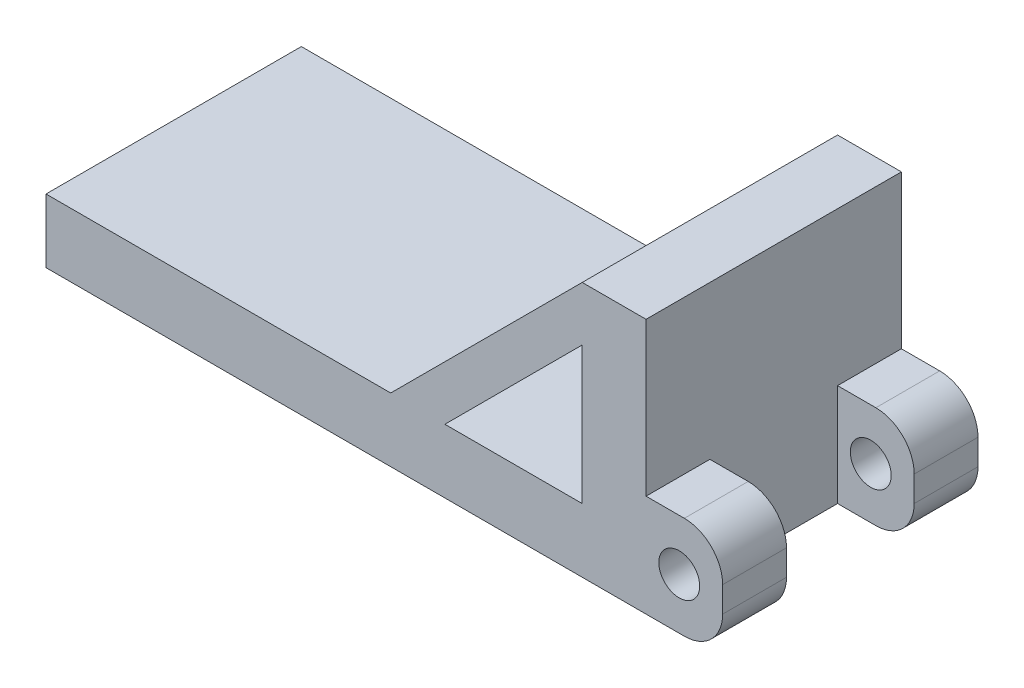
ISO-10303-21;
HEADER;
FILE_DESCRIPTION(('STEP AP214'),'2;1');
FILE_NAME('part.step','',(''),(''),'','','');
FILE_SCHEMA(('AUTOMOTIVE_DESIGN { 1 0 10303 214 1 1 1 1 }'));
ENDSEC;
DATA;
#1=APPLICATION_CONTEXT('core data for automotive mechanical design processes');
#2=APPLICATION_PROTOCOL_DEFINITION('international standard','automotive_design',2000,#1);
#3=PRODUCT_CONTEXT('',#1,'mechanical');
#4=PRODUCT('Part','Part','',(#3));
#5=PRODUCT_RELATED_PRODUCT_CATEGORY('part','',(#4));
#6=PRODUCT_DEFINITION_FORMATION('','',#4);
#7=PRODUCT_DEFINITION_CONTEXT('part definition',#1,'design');
#8=PRODUCT_DEFINITION('design','',#6,#7);
#9=PRODUCT_DEFINITION_SHAPE('','',#8);
#10=(LENGTH_UNIT() NAMED_UNIT(*) SI_UNIT(.MILLI.,.METRE.));
#11=(NAMED_UNIT(*) PLANE_ANGLE_UNIT() SI_UNIT($,.RADIAN.));
#12=(NAMED_UNIT(*) SI_UNIT($,.STERADIAN.) SOLID_ANGLE_UNIT());
#13=UNCERTAINTY_MEASURE_WITH_UNIT(LENGTH_MEASURE(1.E-05),#10,'distance_accuracy_value','');
#14=(GEOMETRIC_REPRESENTATION_CONTEXT(3) GLOBAL_UNCERTAINTY_ASSIGNED_CONTEXT((#13)) GLOBAL_UNIT_ASSIGNED_CONTEXT((#10,
#11,#12)) REPRESENTATION_CONTEXT('',''));
#15=CARTESIAN_POINT('',(0.,0.,0.));
#16=DIRECTION('',(0.,0.,1.));
#17=DIRECTION('',(1.,0.,0.));
#18=AXIS2_PLACEMENT_3D('',#15,#16,#17);
#19=CARTESIAN_POINT('',(8.,0.,20.));
#20=DIRECTION('',(-1.,0.,0.));
#21=DIRECTION('',(0.,0.,1.));
#22=AXIS2_PLACEMENT_3D('',#19,#20,#21);
#23=PLANE('',#22);
#24=DIRECTION('',(0.,0.,-1.));
#25=VECTOR('',#24,1.);
#26=CARTESIAN_POINT('',(8.,5.,20.));
#27=LINE('',#26,#25);
#28=CARTESIAN_POINT('',(8.,5.,0.));
#29=VERTEX_POINT('',#28);
#30=CARTESIAN_POINT('',(8.,5.,5.));
#31=VERTEX_POINT('',#30);
#32=EDGE_CURVE('E186',#29,#31,#27,.F.);
#33=ORIENTED_EDGE('',*,*,#32,.T.);
#34=DIRECTION('',(0.,1.,0.));
#35=VECTOR('',#34,1.);
#36=CARTESIAN_POINT('',(8.00000000000001,-0.000999999999999265,5.));
#37=LINE('',#36,#35);
#38=CARTESIAN_POINT('',(8.,3.,5.));
#39=VERTEX_POINT('',#38);
#40=EDGE_CURVE('E166',#39,#31,#37,.T.);
#41=ORIENTED_EDGE('',*,*,#40,.F.);
#42=DIRECTION('',(0.,0.,-1.));
#43=VECTOR('',#42,1.);
#44=CARTESIAN_POINT('',(8.,3.,20.));
#45=LINE('',#44,#43);
#46=CARTESIAN_POINT('',(8.,3.,0.));
#47=VERTEX_POINT('',#46);
#48=EDGE_CURVE('E193',#39,#47,#45,.T.);
#49=ORIENTED_EDGE('',*,*,#48,.T.);
#50=DIRECTION('',(0.,1.,0.));
#51=VECTOR('',#50,1.);
#52=CARTESIAN_POINT('',(8.,0.,0.));
#53=LINE('',#52,#51);
#54=EDGE_CURVE('E192',#47,#29,#53,.T.);
#55=ORIENTED_EDGE('',*,*,#54,.T.);
#56=EDGE_LOOP('',(#33,#41,#49,#55));
#57=FACE_BOUND('',#56,.T.);
#58=ADVANCED_FACE('F35',(#57),#23,.F.);
#59=CARTESIAN_POINT('',(8.,8.,20.));
#60=DIRECTION('',(0.,-1.,0.));
#61=DIRECTION('',(1.,0.,0.));
#62=AXIS2_PLACEMENT_3D('',#59,#60,#61);
#63=PLANE('',#62);
#64=DIRECTION('',(0.,0.,-1.));
#65=VECTOR('',#64,1.);
#66=CARTESIAN_POINT('',(2.,8.,20.));
#67=LINE('',#66,#65);
#68=CARTESIAN_POINT('',(2.,8.,5.));
#69=VERTEX_POINT('',#68);
#70=CARTESIAN_POINT('',(2.,8.,0.));
#71=VERTEX_POINT('',#70);
#72=EDGE_CURVE('E253',#69,#71,#67,.T.);
#73=ORIENTED_EDGE('',*,*,#72,.F.);
#74=DIRECTION('',(-1.,0.,0.));
#75=VECTOR('',#74,1.);
#76=CARTESIAN_POINT('',(2.,8.,5.));
#77=LINE('',#76,#75);
#78=CARTESIAN_POINT('',(5.,8.,5.));
#79=VERTEX_POINT('',#78);
#80=EDGE_CURVE('E222',#79,#69,#77,.T.);
#81=ORIENTED_EDGE('',*,*,#80,.F.);
#82=DIRECTION('',(0.,0.,-1.));
#83=VECTOR('',#82,1.);
#84=CARTESIAN_POINT('',(5.,8.,20.));
#85=LINE('',#84,#83);
#86=CARTESIAN_POINT('',(5.,8.,0.));
#87=VERTEX_POINT('',#86);
#88=EDGE_CURVE('E43',#79,#87,#85,.T.);
#89=ORIENTED_EDGE('',*,*,#88,.T.);
#90=DIRECTION('',(-1.,0.,0.));
#91=VECTOR('',#90,1.);
#92=CARTESIAN_POINT('',(8.,8.,0.));
#93=LINE('',#92,#91);
#94=EDGE_CURVE('E220',#87,#71,#93,.T.);
#95=ORIENTED_EDGE('',*,*,#94,.T.);
#96=EDGE_LOOP('',(#73,#81,#89,#95));
#97=FACE_BOUND('',#96,.T.);
#98=ADVANCED_FACE('F218',(#97),#63,.F.);
#99=CARTESIAN_POINT('',(4.6,4.,20.));
#100=DIRECTION('',(0.,0.,-1.));
#101=DIRECTION('',(-1.,0.,0.));
#102=AXIS2_PLACEMENT_3D('',#99,#100,#101);
#103=CYLINDRICAL_SURFACE('',#102,1.6);
#104=CARTESIAN_POINT('',(4.6,4.,5.));
#105=DIRECTION('',(0.,0.,-1.));
#106=DIRECTION('',(-1.,0.,0.));
#107=AXIS2_PLACEMENT_3D('',#104,#105,#106);
#108=CIRCLE('',#107,1.6);
#109=CARTESIAN_POINT('',(3.,4.,5.));
#110=VERTEX_POINT('',#109);
#111=EDGE_CURVE('E268',#110,#110,#108,.F.);
#112=ORIENTED_EDGE('',*,*,#111,.T.);
#113=EDGE_LOOP('',(#112));
#114=FACE_BOUND('',#113,.T.);
#115=CARTESIAN_POINT('',(4.6,4.,0.));
#116=DIRECTION('',(0.,0.,1.));
#117=DIRECTION('',(1.,0.,0.));
#118=AXIS2_PLACEMENT_3D('',#115,#116,#117);
#119=CIRCLE('',#118,1.6);
#120=CARTESIAN_POINT('',(6.2,4.,0.));
#121=VERTEX_POINT('',#120);
#122=EDGE_CURVE('E283',#121,#121,#119,.T.);
#123=ORIENTED_EDGE('',*,*,#122,.F.);
#124=EDGE_LOOP('',(#123));
#125=FACE_BOUND('',#124,.T.);
#126=ADVANCED_FACE('F384',(#114,#125),#103,.F.);
#127=CARTESIAN_POINT('',(5.,3.,20.));
#128=DIRECTION('',(0.,0.,-1.));
#129=DIRECTION('',(-1.,0.,0.));
#130=AXIS2_PLACEMENT_3D('',#127,#128,#129);
#131=CYLINDRICAL_SURFACE('',#130,3.);
#132=CARTESIAN_POINT('',(5.,3.,5.));
#133=DIRECTION('',(0.,0.,-1.));
#134=DIRECTION('',(-1.,0.,0.));
#135=AXIS2_PLACEMENT_3D('',#132,#133,#134);
#136=CIRCLE('',#135,3.);
#137=CARTESIAN_POINT('',(4.99999999999999,0.,5.));
#138=VERTEX_POINT('',#137);
#139=EDGE_CURVE('E174',#39,#138,#136,.T.);
#140=ORIENTED_EDGE('',*,*,#139,.T.);
#141=DIRECTION('',(0.,0.,-1.));
#142=VECTOR('',#141,1.);
#143=CARTESIAN_POINT('',(5.,0.,20.));
#144=LINE('',#143,#142);
#145=CARTESIAN_POINT('',(5.,0.,0.));
#146=VERTEX_POINT('',#145);
#147=EDGE_CURVE('E208',#146,#138,#144,.F.);
#148=ORIENTED_EDGE('',*,*,#147,.F.);
#149=CARTESIAN_POINT('',(5.,3.,0.));
#150=DIRECTION('',(0.,0.,1.));
#151=DIRECTION('',(1.,0.,0.));
#152=AXIS2_PLACEMENT_3D('',#149,#150,#151);
#153=CIRCLE('',#152,3.);
#154=EDGE_CURVE('E205',#47,#146,#153,.F.);
#155=ORIENTED_EDGE('',*,*,#154,.F.);
#156=ORIENTED_EDGE('',*,*,#48,.F.);
#157=EDGE_LOOP('',(#140,#148,#155,#156));
#158=FACE_BOUND('',#157,.T.);
#159=ADVANCED_FACE('F340',(#158),#131,.T.);
#160=CARTESIAN_POINT('',(5.,5.,20.));
#161=DIRECTION('',(0.,0.,-1.));
#162=DIRECTION('',(-1.,0.,0.));
#163=AXIS2_PLACEMENT_3D('',#160,#161,#162);
#164=CYLINDRICAL_SURFACE('',#163,3.);
#165=CARTESIAN_POINT('',(5.,5.,5.));
#166=DIRECTION('',(0.,0.,-1.));
#167=DIRECTION('',(-1.,0.,0.));
#168=AXIS2_PLACEMENT_3D('',#165,#166,#167);
#169=CIRCLE('',#168,3.);
#170=EDGE_CURVE('E171',#79,#31,#169,.T.);
#171=ORIENTED_EDGE('',*,*,#170,.T.);
#172=ORIENTED_EDGE('',*,*,#32,.F.);
#173=CARTESIAN_POINT('',(5.,5.,0.));
#174=DIRECTION('',(0.,0.,1.));
#175=DIRECTION('',(1.,0.,0.));
#176=AXIS2_PLACEMENT_3D('',#173,#174,#175);
#177=CIRCLE('',#176,3.);
#178=EDGE_CURVE('E203',#87,#29,#177,.F.);
#179=ORIENTED_EDGE('',*,*,#178,.F.);
#180=ORIENTED_EDGE('',*,*,#88,.F.);
#181=EDGE_LOOP('',(#171,#172,#179,#180));
#182=FACE_BOUND('',#181,.T.);
#183=ADVANCED_FACE('F184',(#182),#164,.T.);
#184=CARTESIAN_POINT('',(0.,0.,20.));
#185=DIRECTION('',(0.,0.,1.));
#186=DIRECTION('',(1.,0.,0.));
#187=AXIS2_PLACEMENT_3D('',#184,#185,#186);
#188=PLANE('',#187);
#189=DIRECTION('',(-0.707106781186551,-0.707106781186544,0.));
#190=VECTOR('',#189,1.);
#191=CARTESIAN_POINT('',(-13.7573593128808,5.,20.));
#192=LINE('',#191,#190);
#193=CARTESIAN_POINT('',(-3.,15.7573593128807,20.));
#194=VERTEX_POINT('',#193);
#195=CARTESIAN_POINT('',(-13.7573593128808,5.,20.));
#196=VERTEX_POINT('',#195);
#197=EDGE_CURVE('E294',#194,#196,#192,.T.);
#198=ORIENTED_EDGE('',*,*,#197,.F.);
#199=DIRECTION('',(0.,1.,0.));
#200=VECTOR('',#199,1.);
#201=CARTESIAN_POINT('',(-3.,15.7573593128807,20.));
#202=LINE('',#201,#200);
#203=CARTESIAN_POINT('',(-3.,5.,20.));
#204=VERTEX_POINT('',#203);
#205=EDGE_CURVE('E292',#204,#194,#202,.T.);
#206=ORIENTED_EDGE('',*,*,#205,.F.);
#207=DIRECTION('',(1.,0.,0.));
#208=VECTOR('',#207,1.);
#209=CARTESIAN_POINT('',(-3.,5.,20.));
#210=LINE('',#209,#208);
#211=EDGE_CURVE('E298',#196,#204,#210,.T.);
#212=ORIENTED_EDGE('',*,*,#211,.F.);
#213=EDGE_LOOP('',(#198,#206,#212));
#214=FACE_BOUND('',#213,.T.);
#215=DIRECTION('',(1.,0.,0.));
#216=VECTOR('',#215,1.);
#217=CARTESIAN_POINT('',(-45.,0.,20.));
#218=LINE('',#217,#216);
#219=CARTESIAN_POINT('',(-45.,0.,20.));
#220=VERTEX_POINT('',#219);
#221=CARTESIAN_POINT('',(4.99999999999998,0.,20.));
#222=VERTEX_POINT('',#221);
#223=EDGE_CURVE('E318',#220,#222,#218,.T.);
#224=ORIENTED_EDGE('',*,*,#223,.T.);
#225=CARTESIAN_POINT('',(5.,3.,20.));
#226=DIRECTION('',(0.,0.,1.));
#227=DIRECTION('',(1.,0.,0.));
#228=AXIS2_PLACEMENT_3D('',#225,#226,#227);
#229=CIRCLE('',#228,3.);
#230=CARTESIAN_POINT('',(8.,3.,20.));
#231=VERTEX_POINT('',#230);
#232=EDGE_CURVE('E211',#222,#231,#229,.T.);
#233=ORIENTED_EDGE('',*,*,#232,.T.);
#234=DIRECTION('',(0.,1.,0.));
#235=VECTOR('',#234,1.);
#236=CARTESIAN_POINT('',(8.,0.,20.));
#237=LINE('',#236,#235);
#238=CARTESIAN_POINT('',(8.,5.,20.));
#239=VERTEX_POINT('',#238);
#240=EDGE_CURVE('E320',#231,#239,#237,.T.);
#241=ORIENTED_EDGE('',*,*,#240,.T.);
#242=CARTESIAN_POINT('',(5.,5.,20.));
#243=DIRECTION('',(0.,0.,1.));
#244=DIRECTION('',(1.,0.,0.));
#245=AXIS2_PLACEMENT_3D('',#242,#243,#244);
#246=CIRCLE('',#245,3.);
#247=CARTESIAN_POINT('',(5.,8.,20.));
#248=VERTEX_POINT('',#247);
#249=EDGE_CURVE('E58',#239,#248,#246,.T.);
#250=ORIENTED_EDGE('',*,*,#249,.T.);
#251=DIRECTION('',(-1.,0.,0.));
#252=VECTOR('',#251,1.);
#253=CARTESIAN_POINT('',(8.,8.,20.));
#254=LINE('',#253,#252);
#255=CARTESIAN_POINT('',(2.,8.,20.));
#256=VERTEX_POINT('',#255);
#257=EDGE_CURVE('E322',#248,#256,#254,.T.);
#258=ORIENTED_EDGE('',*,*,#257,.T.);
#259=DIRECTION('',(0.,1.,0.));
#260=VECTOR('',#259,1.);
#261=CARTESIAN_POINT('',(2.,8.,20.));
#262=LINE('',#261,#260);
#263=CARTESIAN_POINT('',(2.,20.,20.));
#264=VERTEX_POINT('',#263);
#265=EDGE_CURVE('E324',#256,#264,#262,.T.);
#266=ORIENTED_EDGE('',*,*,#265,.T.);
#267=DIRECTION('',(-1.,0.,0.));
#268=VECTOR('',#267,1.);
#269=CARTESIAN_POINT('',(2.,20.,20.));
#270=LINE('',#269,#268);
#271=CARTESIAN_POINT('',(-3.,20.,20.));
#272=VERTEX_POINT('',#271);
#273=EDGE_CURVE('E326',#264,#272,#270,.T.);
#274=ORIENTED_EDGE('',*,*,#273,.T.);
#275=DIRECTION('',(-0.707106781186551,-0.707106781186544,0.));
#276=VECTOR('',#275,1.);
#277=CARTESIAN_POINT('',(-3.,20.,20.));
#278=LINE('',#277,#276);
#279=CARTESIAN_POINT('',(-18.0000000000002,5.,20.));
#280=VERTEX_POINT('',#279);
#281=EDGE_CURVE('E328',#272,#280,#278,.T.);
#282=ORIENTED_EDGE('',*,*,#281,.T.);
#283=DIRECTION('',(-1.,0.,0.));
#284=VECTOR('',#283,1.);
#285=CARTESIAN_POINT('',(-18.0000000000002,5.,20.));
#286=LINE('',#285,#284);
#287=CARTESIAN_POINT('',(-45.,5.,20.));
#288=VERTEX_POINT('',#287);
#289=EDGE_CURVE('E245',#280,#288,#286,.T.);
#290=ORIENTED_EDGE('',*,*,#289,.T.);
#291=DIRECTION('',(0.,-1.,0.));
#292=VECTOR('',#291,1.);
#293=CARTESIAN_POINT('',(-45.,5.,20.));
#294=LINE('',#293,#292);
#295=EDGE_CURVE('E240',#288,#220,#294,.T.);
#296=ORIENTED_EDGE('',*,*,#295,.T.);
#297=EDGE_LOOP('',(#224,#233,#241,#250,#258,#266,#274,#282,#290,#296));
#298=FACE_BOUND('',#297,.T.);
#299=CARTESIAN_POINT('',(4.6,4.,20.));
#300=DIRECTION('',(0.,0.,1.));
#301=DIRECTION('',(1.,0.,0.));
#302=AXIS2_PLACEMENT_3D('',#299,#300,#301);
#303=CIRCLE('',#302,1.6);
#304=CARTESIAN_POINT('',(6.2,4.,20.));
#305=VERTEX_POINT('',#304);
#306=EDGE_CURVE('E286',#305,#305,#303,.T.);
#307=ORIENTED_EDGE('',*,*,#306,.F.);
#308=EDGE_LOOP('',(#307));
#309=FACE_BOUND('',#308,.T.);
#310=ADVANCED_FACE('F351',(#214,#298,#309),#188,.T.);
#311=CARTESIAN_POINT('',(0.,0.,0.));
#312=DIRECTION('',(0.,0.,1.));
#313=DIRECTION('',(1.,0.,0.));
#314=AXIS2_PLACEMENT_3D('',#311,#312,#313);
#315=PLANE('',#314);
#316=ORIENTED_EDGE('',*,*,#54,.F.);
#317=ORIENTED_EDGE('',*,*,#154,.T.);
#318=DIRECTION('',(1.,0.,0.));
#319=VECTOR('',#318,1.);
#320=CARTESIAN_POINT('',(0.,0.,0.));
#321=LINE('',#320,#319);
#322=CARTESIAN_POINT('',(-45.,0.,0.));
#323=VERTEX_POINT('',#322);
#324=EDGE_CURVE('E231',#323,#146,#321,.T.);
#325=ORIENTED_EDGE('',*,*,#324,.F.);
#326=DIRECTION('',(0.,-1.,0.));
#327=VECTOR('',#326,1.);
#328=CARTESIAN_POINT('',(-45.,5.,0.));
#329=LINE('',#328,#327);
#330=CARTESIAN_POINT('',(-45.,5.,0.));
#331=VERTEX_POINT('',#330);
#332=EDGE_CURVE('E315',#331,#323,#329,.T.);
#333=ORIENTED_EDGE('',*,*,#332,.F.);
#334=DIRECTION('',(-1.,0.,0.));
#335=VECTOR('',#334,1.);
#336=CARTESIAN_POINT('',(-18.0000000000002,5.,0.));
#337=LINE('',#336,#335);
#338=CARTESIAN_POINT('',(-18.0000000000002,5.,0.));
#339=VERTEX_POINT('',#338);
#340=EDGE_CURVE('E238',#339,#331,#337,.T.);
#341=ORIENTED_EDGE('',*,*,#340,.F.);
#342=DIRECTION('',(-0.707106781186551,-0.707106781186544,0.));
#343=VECTOR('',#342,1.);
#344=CARTESIAN_POINT('',(-3.,20.,0.));
#345=LINE('',#344,#343);
#346=CARTESIAN_POINT('',(-3.,20.,0.));
#347=VERTEX_POINT('',#346);
#348=EDGE_CURVE('E236',#347,#339,#345,.T.);
#349=ORIENTED_EDGE('',*,*,#348,.F.);
#350=DIRECTION('',(-1.,0.,0.));
#351=VECTOR('',#350,1.);
#352=CARTESIAN_POINT('',(2.,20.,0.));
#353=LINE('',#352,#351);
#354=CARTESIAN_POINT('',(2.,20.,0.));
#355=VERTEX_POINT('',#354);
#356=EDGE_CURVE('E229',#355,#347,#353,.T.);
#357=ORIENTED_EDGE('',*,*,#356,.F.);
#358=DIRECTION('',(0.,1.,0.));
#359=VECTOR('',#358,1.);
#360=CARTESIAN_POINT('',(2.,8.,0.));
#361=LINE('',#360,#359);
#362=EDGE_CURVE('E227',#71,#355,#361,.T.);
#363=ORIENTED_EDGE('',*,*,#362,.F.);
#364=ORIENTED_EDGE('',*,*,#94,.F.);
#365=ORIENTED_EDGE('',*,*,#178,.T.);
#366=EDGE_LOOP('',(#316,#317,#325,#333,#341,#349,#357,#363,#364,#365));
#367=FACE_BOUND('',#366,.T.);
#368=DIRECTION('',(0.,1.,0.));
#369=VECTOR('',#368,1.);
#370=CARTESIAN_POINT('',(-3.,15.7573593128807,0.));
#371=LINE('',#370,#369);
#372=CARTESIAN_POINT('',(-3.,5.,0.));
#373=VERTEX_POINT('',#372);
#374=CARTESIAN_POINT('',(-3.,15.7573593128807,0.));
#375=VERTEX_POINT('',#374);
#376=EDGE_CURVE('E289',#373,#375,#371,.T.);
#377=ORIENTED_EDGE('',*,*,#376,.T.);
#378=DIRECTION('',(-0.707106781186551,-0.707106781186544,0.));
#379=VECTOR('',#378,1.);
#380=CARTESIAN_POINT('',(-13.7573593128808,5.,0.));
#381=LINE('',#380,#379);
#382=CARTESIAN_POINT('',(-13.7573593128808,5.,0.));
#383=VERTEX_POINT('',#382);
#384=EDGE_CURVE('E303',#375,#383,#381,.T.);
#385=ORIENTED_EDGE('',*,*,#384,.T.);
#386=DIRECTION('',(1.,0.,0.));
#387=VECTOR('',#386,1.);
#388=CARTESIAN_POINT('',(-3.,5.,0.));
#389=LINE('',#388,#387);
#390=EDGE_CURVE('E295',#383,#373,#389,.T.);
#391=ORIENTED_EDGE('',*,*,#390,.T.);
#392=EDGE_LOOP('',(#377,#385,#391));
#393=FACE_BOUND('',#392,.T.);
#394=ORIENTED_EDGE('',*,*,#122,.T.);
#395=EDGE_LOOP('',(#394));
#396=FACE_BOUND('',#395,.T.);
#397=ADVANCED_FACE('F224',(#367,#393,#396),#315,.F.);
#398=CARTESIAN_POINT('',(-45.,5.,20.));
#399=DIRECTION('',(1.,0.,0.));
#400=DIRECTION('',(0.,0.,-1.));
#401=AXIS2_PLACEMENT_3D('',#398,#399,#400);
#402=PLANE('',#401);
#403=ORIENTED_EDGE('',*,*,#332,.T.);
#404=DIRECTION('',(0.,0.,-1.));
#405=VECTOR('',#404,1.);
#406=CARTESIAN_POINT('',(-45.,0.,20.));
#407=LINE('',#406,#405);
#408=EDGE_CURVE('E198',#220,#323,#407,.T.);
#409=ORIENTED_EDGE('',*,*,#408,.F.);
#410=ORIENTED_EDGE('',*,*,#295,.F.);
#411=DIRECTION('',(0.,0.,-1.));
#412=VECTOR('',#411,1.);
#413=CARTESIAN_POINT('',(-45.,5.,20.));
#414=LINE('',#413,#412);
#415=EDGE_CURVE('E241',#288,#331,#414,.T.);
#416=ORIENTED_EDGE('',*,*,#415,.T.);
#417=EDGE_LOOP('',(#403,#409,#410,#416));
#418=FACE_BOUND('',#417,.T.);
#419=ADVANCED_FACE('F369',(#418),#402,.F.);
#420=CARTESIAN_POINT('',(0.,0.,20.));
#421=DIRECTION('',(0.,1.,0.));
#422=DIRECTION('',(0.,0.,1.));
#423=AXIS2_PLACEMENT_3D('',#420,#421,#422);
#424=PLANE('',#423);
#425=ORIENTED_EDGE('',*,*,#147,.T.);
#426=DIRECTION('',(1.,0.,0.));
#427=VECTOR('',#426,1.);
#428=CARTESIAN_POINT('',(2.,0.,5.));
#429=LINE('',#428,#427);
#430=CARTESIAN_POINT('',(2.,0.,5.));
#431=VERTEX_POINT('',#430);
#432=EDGE_CURVE('E341',#431,#138,#429,.T.);
#433=ORIENTED_EDGE('',*,*,#432,.F.);
#434=DIRECTION('',(0.,0.,-1.));
#435=VECTOR('',#434,1.);
#436=CARTESIAN_POINT('',(2.,0.,15.));
#437=LINE('',#436,#435);
#438=CARTESIAN_POINT('',(2.,0.,15.));
#439=VERTEX_POINT('',#438);
#440=EDGE_CURVE('E178',#439,#431,#437,.T.);
#441=ORIENTED_EDGE('',*,*,#440,.F.);
#442=DIRECTION('',(-1.,0.,0.));
#443=VECTOR('',#442,1.);
#444=CARTESIAN_POINT('',(8.00000000000001,0.,15.));
#445=LINE('',#444,#443);
#446=CARTESIAN_POINT('',(4.99999999999999,0.,15.));
#447=VERTEX_POINT('',#446);
#448=EDGE_CURVE('E187',#447,#439,#445,.T.);
#449=ORIENTED_EDGE('',*,*,#448,.F.);
#450=EDGE_CURVE('E207',#447,#222,#144,.F.);
#451=ORIENTED_EDGE('',*,*,#450,.T.);
#452=ORIENTED_EDGE('',*,*,#223,.F.);
#453=ORIENTED_EDGE('',*,*,#408,.T.);
#454=ORIENTED_EDGE('',*,*,#324,.T.);
#455=EDGE_LOOP('',(#425,#433,#441,#449,#451,#452,#453,#454));
#456=FACE_BOUND('',#455,.T.);
#457=ADVANCED_FACE('F335',(#456),#424,.F.);
#458=CARTESIAN_POINT('',(8.,3.,15.));
#459=VERTEX_POINT('',#458);
#460=EDGE_CURVE('E196',#231,#459,#45,.T.);
#461=ORIENTED_EDGE('',*,*,#460,.T.);
#462=DIRECTION('',(0.,1.,0.));
#463=VECTOR('',#462,1.);
#464=CARTESIAN_POINT('',(8.00000000000001,-0.000999999999999265,15.));
#465=LINE('',#464,#463);
#466=CARTESIAN_POINT('',(8.,5.,15.));
#467=VERTEX_POINT('',#466);
#468=EDGE_CURVE('E179',#459,#467,#465,.T.);
#469=ORIENTED_EDGE('',*,*,#468,.T.);
#470=EDGE_CURVE('E194',#467,#239,#27,.F.);
#471=ORIENTED_EDGE('',*,*,#470,.T.);
#472=ORIENTED_EDGE('',*,*,#240,.F.);
#473=EDGE_LOOP('',(#461,#469,#471,#472));
#474=FACE_BOUND('',#473,.T.);
#475=ADVANCED_FACE('F376',(#474),#23,.F.);
#476=CARTESIAN_POINT('',(5.,8.,15.));
#477=VERTEX_POINT('',#476);
#478=EDGE_CURVE('E11',#248,#477,#85,.T.);
#479=ORIENTED_EDGE('',*,*,#478,.T.);
#480=DIRECTION('',(1.,0.,0.));
#481=VECTOR('',#480,1.);
#482=CARTESIAN_POINT('',(8.,8.,15.));
#483=LINE('',#482,#481);
#484=CARTESIAN_POINT('',(2.,8.,15.));
#485=VERTEX_POINT('',#484);
#486=EDGE_CURVE('E50',#485,#477,#483,.T.);
#487=ORIENTED_EDGE('',*,*,#486,.F.);
#488=EDGE_CURVE('E254',#256,#485,#67,.T.);
#489=ORIENTED_EDGE('',*,*,#488,.F.);
#490=ORIENTED_EDGE('',*,*,#257,.F.);
#491=EDGE_LOOP('',(#479,#487,#489,#490));
#492=FACE_BOUND('',#491,.T.);
#493=ADVANCED_FACE('F350',(#492),#63,.F.);
#494=CARTESIAN_POINT('',(2.,8.,20.));
#495=DIRECTION('',(-1.,0.,0.));
#496=DIRECTION('',(0.,-1.,0.));
#497=AXIS2_PLACEMENT_3D('',#494,#495,#496);
#498=PLANE('',#497);
#499=ORIENTED_EDGE('',*,*,#362,.T.);
#500=DIRECTION('',(0.,0.,-1.));
#501=VECTOR('',#500,1.);
#502=CARTESIAN_POINT('',(2.,20.,20.));
#503=LINE('',#502,#501);
#504=EDGE_CURVE('E251',#264,#355,#503,.T.);
#505=ORIENTED_EDGE('',*,*,#504,.F.);
#506=ORIENTED_EDGE('',*,*,#265,.F.);
#507=ORIENTED_EDGE('',*,*,#488,.T.);
#508=DIRECTION('',(0.,1.,0.));
#509=VECTOR('',#508,1.);
#510=CARTESIAN_POINT('',(2.,-0.001000000000001,15.));
#511=LINE('',#510,#509);
#512=EDGE_CURVE('E266',#439,#485,#511,.T.);
#513=ORIENTED_EDGE('',*,*,#512,.F.);
#514=ORIENTED_EDGE('',*,*,#440,.T.);
#515=DIRECTION('',(0.,1.,0.));
#516=VECTOR('',#515,1.);
#517=CARTESIAN_POINT('',(2.,-0.001000000000001,5.));
#518=LINE('',#517,#516);
#519=EDGE_CURVE('E263',#431,#69,#518,.T.);
#520=ORIENTED_EDGE('',*,*,#519,.T.);
#521=ORIENTED_EDGE('',*,*,#72,.T.);
#522=EDGE_LOOP('',(#499,#505,#506,#507,#513,#514,#520,#521));
#523=FACE_BOUND('',#522,.T.);
#524=ADVANCED_FACE('F260',(#523),#498,.F.);
#525=CARTESIAN_POINT('',(2.,20.,20.));
#526=DIRECTION('',(0.,-1.,0.));
#527=DIRECTION('',(0.,0.,-1.));
#528=AXIS2_PLACEMENT_3D('',#525,#526,#527);
#529=PLANE('',#528);
#530=ORIENTED_EDGE('',*,*,#356,.T.);
#531=DIRECTION('',(0.,0.,-1.));
#532=VECTOR('',#531,1.);
#533=CARTESIAN_POINT('',(-3.,20.,20.));
#534=LINE('',#533,#532);
#535=EDGE_CURVE('E248',#272,#347,#534,.T.);
#536=ORIENTED_EDGE('',*,*,#535,.F.);
#537=ORIENTED_EDGE('',*,*,#273,.F.);
#538=ORIENTED_EDGE('',*,*,#504,.T.);
#539=EDGE_LOOP('',(#530,#536,#537,#538));
#540=FACE_BOUND('',#539,.T.);
#541=ADVANCED_FACE('F356',(#540),#529,.F.);
#542=CARTESIAN_POINT('',(-3.,20.,20.));
#543=DIRECTION('',(0.707106781186544,-0.707106781186551,0.));
#544=DIRECTION('',(0.707106781186551,0.707106781186544,0.));
#545=AXIS2_PLACEMENT_3D('',#542,#543,#544);
#546=PLANE('',#545);
#547=ORIENTED_EDGE('',*,*,#348,.T.);
#548=DIRECTION('',(0.,0.,-1.));
#549=VECTOR('',#548,1.);
#550=CARTESIAN_POINT('',(-18.0000000000002,5.,20.));
#551=LINE('',#550,#549);
#552=EDGE_CURVE('E244',#280,#339,#551,.T.);
#553=ORIENTED_EDGE('',*,*,#552,.F.);
#554=ORIENTED_EDGE('',*,*,#281,.F.);
#555=ORIENTED_EDGE('',*,*,#535,.T.);
#556=EDGE_LOOP('',(#547,#553,#554,#555));
#557=FACE_BOUND('',#556,.T.);
#558=ADVANCED_FACE('F361',(#557),#546,.F.);
#559=CARTESIAN_POINT('',(-18.0000000000002,5.,20.));
#560=DIRECTION('',(0.,-1.,0.));
#561=DIRECTION('',(1.,0.,0.));
#562=AXIS2_PLACEMENT_3D('',#559,#560,#561);
#563=PLANE('',#562);
#564=ORIENTED_EDGE('',*,*,#340,.T.);
#565=ORIENTED_EDGE('',*,*,#415,.F.);
#566=ORIENTED_EDGE('',*,*,#289,.F.);
#567=ORIENTED_EDGE('',*,*,#552,.T.);
#568=EDGE_LOOP('',(#564,#565,#566,#567));
#569=FACE_BOUND('',#568,.T.);
#570=ADVANCED_FACE('F366',(#569),#563,.F.);
#571=CARTESIAN_POINT('',(-3.,15.7573593128807,20.));
#572=DIRECTION('',(-1.,0.,0.));
#573=DIRECTION('',(0.,-1.,0.));
#574=AXIS2_PLACEMENT_3D('',#571,#572,#573);
#575=PLANE('',#574);
#576=ORIENTED_EDGE('',*,*,#376,.F.);
#577=DIRECTION('',(0.,0.,-1.));
#578=VECTOR('',#577,1.);
#579=CARTESIAN_POINT('',(-3.,5.,20.));
#580=LINE('',#579,#578);
#581=EDGE_CURVE('E300',#204,#373,#580,.T.);
#582=ORIENTED_EDGE('',*,*,#581,.F.);
#583=ORIENTED_EDGE('',*,*,#205,.T.);
#584=DIRECTION('',(0.,0.,-1.));
#585=VECTOR('',#584,1.);
#586=CARTESIAN_POINT('',(-3.,15.7573593128807,20.));
#587=LINE('',#586,#585);
#588=EDGE_CURVE('E312',#194,#375,#587,.T.);
#589=ORIENTED_EDGE('',*,*,#588,.T.);
#590=EDGE_LOOP('',(#576,#582,#583,#589));
#591=FACE_BOUND('',#590,.T.);
#592=ADVANCED_FACE('F416',(#591),#575,.T.);
#593=CARTESIAN_POINT('',(-13.7573593128808,5.,20.));
#594=DIRECTION('',(0.707106781186544,-0.707106781186551,0.));
#595=DIRECTION('',(0.707106781186551,0.707106781186544,0.));
#596=AXIS2_PLACEMENT_3D('',#593,#594,#595);
#597=PLANE('',#596);
#598=ORIENTED_EDGE('',*,*,#384,.F.);
#599=ORIENTED_EDGE('',*,*,#588,.F.);
#600=ORIENTED_EDGE('',*,*,#197,.T.);
#601=DIRECTION('',(0.,0.,-1.));
#602=VECTOR('',#601,1.);
#603=CARTESIAN_POINT('',(-13.7573593128808,5.,20.));
#604=LINE('',#603,#602);
#605=EDGE_CURVE('E310',#196,#383,#604,.T.);
#606=ORIENTED_EDGE('',*,*,#605,.T.);
#607=EDGE_LOOP('',(#598,#599,#600,#606));
#608=FACE_BOUND('',#607,.T.);
#609=ADVANCED_FACE('F449',(#608),#597,.T.);
#610=CARTESIAN_POINT('',(-3.,5.,20.));
#611=DIRECTION('',(0.,1.,0.));
#612=DIRECTION('',(-1.,0.,0.));
#613=AXIS2_PLACEMENT_3D('',#610,#611,#612);
#614=PLANE('',#613);
#615=ORIENTED_EDGE('',*,*,#390,.F.);
#616=ORIENTED_EDGE('',*,*,#605,.F.);
#617=ORIENTED_EDGE('',*,*,#211,.T.);
#618=ORIENTED_EDGE('',*,*,#581,.T.);
#619=EDGE_LOOP('',(#615,#616,#617,#618));
#620=FACE_BOUND('',#619,.T.);
#621=ADVANCED_FACE('F405',(#620),#614,.T.);
#622=CARTESIAN_POINT('',(4.6,4.,15.));
#623=DIRECTION('',(0.,0.,1.));
#624=DIRECTION('',(1.,0.,0.));
#625=AXIS2_PLACEMENT_3D('',#622,#623,#624);
#626=CIRCLE('',#625,1.6);
#627=CARTESIAN_POINT('',(6.2,4.,15.));
#628=VERTEX_POINT('',#627);
#629=EDGE_CURVE('E272',#628,#628,#626,.F.);
#630=ORIENTED_EDGE('',*,*,#629,.T.);
#631=EDGE_LOOP('',(#630));
#632=FACE_BOUND('',#631,.T.);
#633=ORIENTED_EDGE('',*,*,#306,.T.);
#634=EDGE_LOOP('',(#633));
#635=FACE_BOUND('',#634,.T.);
#636=ADVANCED_FACE('F402',(#632,#635),#103,.F.);
#637=CARTESIAN_POINT('',(5.,3.,15.));
#638=DIRECTION('',(0.,0.,1.));
#639=DIRECTION('',(1.,0.,0.));
#640=AXIS2_PLACEMENT_3D('',#637,#638,#639);
#641=CIRCLE('',#640,3.);
#642=EDGE_CURVE('E280',#447,#459,#641,.T.);
#643=ORIENTED_EDGE('',*,*,#642,.T.);
#644=ORIENTED_EDGE('',*,*,#460,.F.);
#645=ORIENTED_EDGE('',*,*,#232,.F.);
#646=ORIENTED_EDGE('',*,*,#450,.F.);
#647=EDGE_LOOP('',(#643,#644,#645,#646));
#648=FACE_BOUND('',#647,.T.);
#649=ADVANCED_FACE('F393',(#648),#131,.T.);
#650=CARTESIAN_POINT('',(5.,5.,15.));
#651=DIRECTION('',(0.,0.,1.));
#652=DIRECTION('',(1.,0.,0.));
#653=AXIS2_PLACEMENT_3D('',#650,#651,#652);
#654=CIRCLE('',#653,3.);
#655=EDGE_CURVE('E188',#467,#477,#654,.T.);
#656=ORIENTED_EDGE('',*,*,#655,.T.);
#657=ORIENTED_EDGE('',*,*,#478,.F.);
#658=ORIENTED_EDGE('',*,*,#249,.F.);
#659=ORIENTED_EDGE('',*,*,#470,.F.);
#660=EDGE_LOOP('',(#656,#657,#658,#659));
#661=FACE_BOUND('',#660,.T.);
#662=ADVANCED_FACE('F37',(#661),#164,.T.);
#663=CARTESIAN_POINT('',(2.,-0.001000000000001,5.));
#664=DIRECTION('',(0.,0.,-1.));
#665=DIRECTION('',(-1.,0.,0.));
#666=AXIS2_PLACEMENT_3D('',#663,#664,#665);
#667=PLANE('',#666);
#668=ORIENTED_EDGE('',*,*,#432,.T.);
#669=ORIENTED_EDGE('',*,*,#139,.F.);
#670=ORIENTED_EDGE('',*,*,#40,.T.);
#671=ORIENTED_EDGE('',*,*,#170,.F.);
#672=ORIENTED_EDGE('',*,*,#80,.T.);
#673=ORIENTED_EDGE('',*,*,#519,.F.);
#674=EDGE_LOOP('',(#668,#669,#670,#671,#672,#673));
#675=FACE_BOUND('',#674,.T.);
#676=ORIENTED_EDGE('',*,*,#111,.F.);
#677=EDGE_LOOP('',(#676));
#678=FACE_BOUND('',#677,.T.);
#679=ADVANCED_FACE('F168',(#675,#678),#667,.F.);
#680=CARTESIAN_POINT('',(8.00000000000001,-0.000999999999999265,15.));
#681=DIRECTION('',(0.,0.,1.));
#682=DIRECTION('',(1.,0.,0.));
#683=AXIS2_PLACEMENT_3D('',#680,#681,#682);
#684=PLANE('',#683);
#685=ORIENTED_EDGE('',*,*,#448,.T.);
#686=ORIENTED_EDGE('',*,*,#512,.T.);
#687=ORIENTED_EDGE('',*,*,#486,.T.);
#688=ORIENTED_EDGE('',*,*,#655,.F.);
#689=ORIENTED_EDGE('',*,*,#468,.F.);
#690=ORIENTED_EDGE('',*,*,#642,.F.);
#691=EDGE_LOOP('',(#685,#686,#687,#688,#689,#690));
#692=FACE_BOUND('',#691,.T.);
#693=ORIENTED_EDGE('',*,*,#629,.F.);
#694=EDGE_LOOP('',(#693));
#695=FACE_BOUND('',#694,.T.);
#696=ADVANCED_FACE('F396',(#692,#695),#684,.F.);
#697=CLOSED_SHELL('',(#58,#98,#126,#159,#183,#310,#397,#419,#457,#475,#493,#524,#541,#558,#570,
#592,#609,#621,#636,#649,#662,#679,#696));
#698=MANIFOLD_SOLID_BREP('B2',#697);
#699=ADVANCED_BREP_SHAPE_REPRESENTATION('',(#18,#698),#14);
#700=SHAPE_DEFINITION_REPRESENTATION(#9,#699);
ENDSEC;
END-ISO-10303-21;
